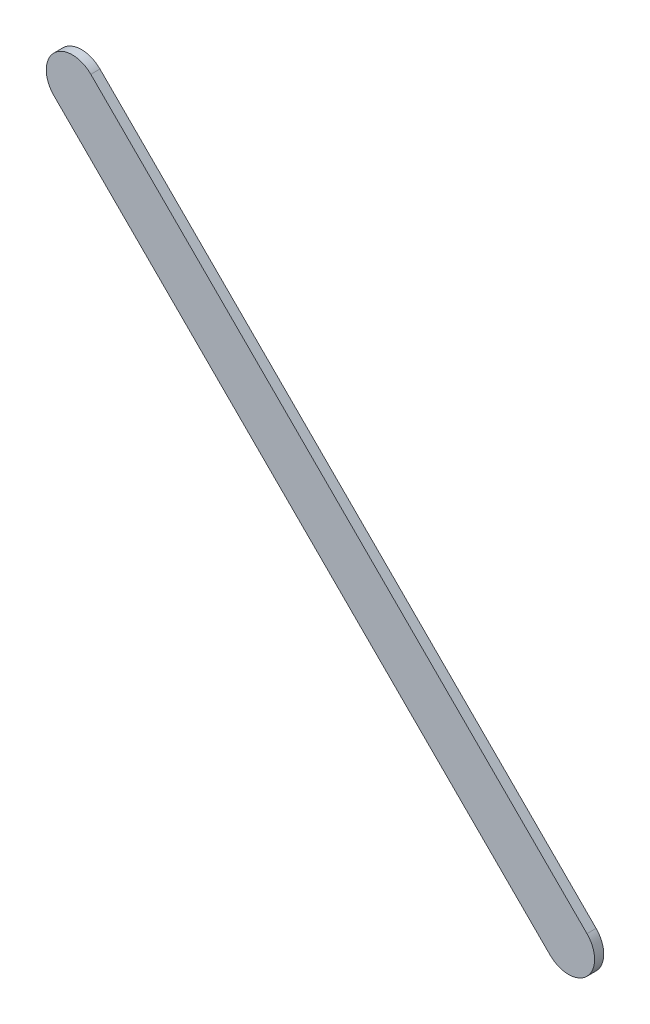
ISO-10303-21;
HEADER;
FILE_DESCRIPTION(('STEP AP214'),'2;1');
FILE_NAME('part.step','',(''),(''),'','','');
FILE_SCHEMA(('AUTOMOTIVE_DESIGN { 1 0 10303 214 1 1 1 1 }'));
ENDSEC;
DATA;
#1=APPLICATION_CONTEXT('core data for automotive mechanical design processes');
#2=APPLICATION_PROTOCOL_DEFINITION('international standard','automotive_design',2000,#1);
#3=PRODUCT_CONTEXT('',#1,'mechanical');
#4=PRODUCT('Part','Part','',(#3));
#5=PRODUCT_RELATED_PRODUCT_CATEGORY('part','',(#4));
#6=PRODUCT_DEFINITION_FORMATION('','',#4);
#7=PRODUCT_DEFINITION_CONTEXT('part definition',#1,'design');
#8=PRODUCT_DEFINITION('design','',#6,#7);
#9=PRODUCT_DEFINITION_SHAPE('','',#8);
#10=(LENGTH_UNIT() NAMED_UNIT(*) SI_UNIT(.MILLI.,.METRE.));
#11=(NAMED_UNIT(*) PLANE_ANGLE_UNIT() SI_UNIT($,.RADIAN.));
#12=(NAMED_UNIT(*) SI_UNIT($,.STERADIAN.) SOLID_ANGLE_UNIT());
#13=UNCERTAINTY_MEASURE_WITH_UNIT(LENGTH_MEASURE(1.E-05),#10,'distance_accuracy_value','');
#14=(GEOMETRIC_REPRESENTATION_CONTEXT(3) GLOBAL_UNCERTAINTY_ASSIGNED_CONTEXT((#13)) GLOBAL_UNIT_ASSIGNED_CONTEXT((#10,
#11,#12)) REPRESENTATION_CONTEXT('',''));
#15=CARTESIAN_POINT('',(0.,0.,0.));
#16=DIRECTION('',(0.,0.,1.));
#17=DIRECTION('',(1.,0.,0.));
#18=AXIS2_PLACEMENT_3D('',#15,#16,#17);
#19=CARTESIAN_POINT('',(85.391789,-130.37071,1.635));
#20=DIRECTION('',(0.,0.,1.));
#21=DIRECTION('',(1.,0.,0.));
#22=AXIS2_PLACEMENT_3D('',#19,#20,#21);
#23=PLANE('',#22);
#24=DIRECTION('',(0.707106781186548,-0.707106781186548,0.));
#25=VECTOR('',#24,1.);
#26=CARTESIAN_POINT('',(85.391789,-130.37071,1.635));
#27=LINE('',#26,#25);
#28=CARTESIAN_POINT('',(85.391789,-130.37071,1.635));
#29=VERTEX_POINT('',#28);
#30=CARTESIAN_POINT('',(87.291789,-132.27071,1.635));
#31=VERTEX_POINT('',#30);
#32=EDGE_CURVE('E70',#29,#31,#27,.T.);
#33=ORIENTED_EDGE('',*,*,#32,.T.);
#34=CARTESIAN_POINT('',(87.3624995,-132.1999995,1.635));
#35=DIRECTION('',(0.,0.,1.));
#36=DIRECTION('',(-0.707106781186048,-0.707106781187047,0.));
#37=AXIS2_PLACEMENT_3D('',#34,#35,#36);
#38=CIRCLE('',#37,0.09999974810219);
#39=CARTESIAN_POINT('',(87.43321,-132.129289,1.635));
#40=VERTEX_POINT('',#39);
#41=EDGE_CURVE('E107',#31,#40,#38,.T.);
#42=ORIENTED_EDGE('',*,*,#41,.T.);
#43=DIRECTION('',(-0.707106781186548,0.707106781186548,0.));
#44=VECTOR('',#43,1.);
#45=CARTESIAN_POINT('',(87.43321,-132.129289,1.635));
#46=LINE('',#45,#44);
#47=CARTESIAN_POINT('',(85.53321,-130.229289,1.635));
#48=VERTEX_POINT('',#47);
#49=EDGE_CURVE('E72',#40,#48,#46,.T.);
#50=ORIENTED_EDGE('',*,*,#49,.T.);
#51=CARTESIAN_POINT('',(85.4624995,-130.2999995,1.635));
#52=DIRECTION('',(0.,0.,1.));
#53=DIRECTION('',(0.707106781186048,0.707106781187047,0.));
#54=AXIS2_PLACEMENT_3D('',#51,#52,#53);
#55=CIRCLE('',#54,0.09999974810219);
#56=EDGE_CURVE('E11',#48,#29,#55,.T.);
#57=ORIENTED_EDGE('',*,*,#56,.T.);
#58=EDGE_LOOP('',(#33,#42,#50,#57));
#59=FACE_BOUND('',#58,.T.);
#60=ADVANCED_FACE('F17',(#59),#23,.T.);
#61=CARTESIAN_POINT('',(85.391789,-130.37071,1.6));
#62=DIRECTION('',(0.,0.,1.));
#63=DIRECTION('',(1.,0.,0.));
#64=AXIS2_PLACEMENT_3D('',#61,#62,#63);
#65=PLANE('',#64);
#66=CARTESIAN_POINT('',(85.4624995,-130.2999995,1.6));
#67=DIRECTION('',(0.,0.,1.));
#68=DIRECTION('',(0.707106781186048,0.707106781187047,0.));
#69=AXIS2_PLACEMENT_3D('',#66,#67,#68);
#70=CIRCLE('',#69,0.09999974810219);
#71=CARTESIAN_POINT('',(85.53321,-130.229289,1.6));
#72=VERTEX_POINT('',#71);
#73=CARTESIAN_POINT('',(85.391789,-130.37071,1.6));
#74=VERTEX_POINT('',#73);
#75=EDGE_CURVE('E25',#72,#74,#70,.T.);
#76=ORIENTED_EDGE('',*,*,#75,.F.);
#77=DIRECTION('',(-0.707106781186548,0.707106781186548,0.));
#78=VECTOR('',#77,1.);
#79=CARTESIAN_POINT('',(87.43321,-132.129289,1.6));
#80=LINE('',#79,#78);
#81=CARTESIAN_POINT('',(87.43321,-132.129289,1.6));
#82=VERTEX_POINT('',#81);
#83=EDGE_CURVE('E95',#82,#72,#80,.T.);
#84=ORIENTED_EDGE('',*,*,#83,.F.);
#85=CARTESIAN_POINT('',(87.3624995,-132.1999995,1.6));
#86=DIRECTION('',(0.,0.,1.));
#87=DIRECTION('',(-0.707106781186048,-0.707106781187047,0.));
#88=AXIS2_PLACEMENT_3D('',#85,#86,#87);
#89=CIRCLE('',#88,0.09999974810219);
#90=CARTESIAN_POINT('',(87.291789,-132.27071,1.6));
#91=VERTEX_POINT('',#90);
#92=EDGE_CURVE('E80',#91,#82,#89,.T.);
#93=ORIENTED_EDGE('',*,*,#92,.F.);
#94=DIRECTION('',(0.707106781186548,-0.707106781186548,0.));
#95=VECTOR('',#94,1.);
#96=CARTESIAN_POINT('',(85.391789,-130.37071,1.6));
#97=LINE('',#96,#95);
#98=EDGE_CURVE('E91',#74,#91,#97,.T.);
#99=ORIENTED_EDGE('',*,*,#98,.F.);
#100=EDGE_LOOP('',(#76,#84,#93,#99));
#101=FACE_BOUND('',#100,.T.);
#102=ADVANCED_FACE('F118',(#101),#65,.F.);
#103=CARTESIAN_POINT('',(85.4624995,-130.2999995,1.6));
#104=DIRECTION('',(0.,0.,-1.));
#105=DIRECTION('',(0.707106781186048,0.707106781187048,0.));
#106=AXIS2_PLACEMENT_3D('',#103,#104,#105);
#107=CYLINDRICAL_SURFACE('',#106,0.09999974810219);
#108=ORIENTED_EDGE('',*,*,#75,.T.);
#109=DIRECTION('',(0.,0.,1.));
#110=VECTOR('',#109,1.);
#111=CARTESIAN_POINT('',(85.391789,-130.37071,1.6));
#112=LINE('',#111,#110);
#113=EDGE_CURVE('E75',#74,#29,#112,.T.);
#114=ORIENTED_EDGE('',*,*,#113,.T.);
#115=ORIENTED_EDGE('',*,*,#56,.F.);
#116=DIRECTION('',(0.,0.,1.));
#117=VECTOR('',#116,1.);
#118=CARTESIAN_POINT('',(85.53321,-130.229289,1.6));
#119=LINE('',#118,#117);
#120=EDGE_CURVE('E97',#72,#48,#119,.T.);
#121=ORIENTED_EDGE('',*,*,#120,.F.);
#122=EDGE_LOOP('',(#108,#114,#115,#121));
#123=FACE_BOUND('',#122,.T.);
#124=ADVANCED_FACE('F76',(#123),#107,.T.);
#125=CARTESIAN_POINT('',(87.43321,-132.129289,1.6));
#126=DIRECTION('',(-0.707106781186548,-0.707106781186548,0.));
#127=DIRECTION('',(-0.707106781186548,0.707106781186548,0.));
#128=AXIS2_PLACEMENT_3D('',#125,#126,#127);
#129=PLANE('',#128);
#130=ORIENTED_EDGE('',*,*,#83,.T.);
#131=ORIENTED_EDGE('',*,*,#120,.T.);
#132=ORIENTED_EDGE('',*,*,#49,.F.);
#133=DIRECTION('',(0.,0.,1.));
#134=VECTOR('',#133,1.);
#135=CARTESIAN_POINT('',(87.43321,-132.129289,1.6));
#136=LINE('',#135,#134);
#137=EDGE_CURVE('E102',#82,#40,#136,.T.);
#138=ORIENTED_EDGE('',*,*,#137,.F.);
#139=EDGE_LOOP('',(#130,#131,#132,#138));
#140=FACE_BOUND('',#139,.T.);
#141=ADVANCED_FACE('F117',(#140),#129,.F.);
#142=CARTESIAN_POINT('',(87.3624995,-132.1999995,1.6));
#143=DIRECTION('',(0.,0.,-1.));
#144=DIRECTION('',(-0.707106781186048,-0.707106781187048,0.));
#145=AXIS2_PLACEMENT_3D('',#142,#143,#144);
#146=CYLINDRICAL_SURFACE('',#145,0.09999974810219);
#147=ORIENTED_EDGE('',*,*,#92,.T.);
#148=ORIENTED_EDGE('',*,*,#137,.T.);
#149=ORIENTED_EDGE('',*,*,#41,.F.);
#150=DIRECTION('',(0.,0.,1.));
#151=VECTOR('',#150,1.);
#152=CARTESIAN_POINT('',(87.291789,-132.27071,1.6));
#153=LINE('',#152,#151);
#154=EDGE_CURVE('E84',#91,#31,#153,.T.);
#155=ORIENTED_EDGE('',*,*,#154,.F.);
#156=EDGE_LOOP('',(#147,#148,#149,#155));
#157=FACE_BOUND('',#156,.T.);
#158=ADVANCED_FACE('F120',(#157),#146,.T.);
#159=CARTESIAN_POINT('',(85.391789,-130.37071,1.6));
#160=DIRECTION('',(0.707106781186548,0.707106781186548,0.));
#161=DIRECTION('',(0.,0.,-1.));
#162=AXIS2_PLACEMENT_3D('',#159,#160,#161);
#163=PLANE('',#162);
#164=ORIENTED_EDGE('',*,*,#98,.T.);
#165=ORIENTED_EDGE('',*,*,#154,.T.);
#166=ORIENTED_EDGE('',*,*,#32,.F.);
#167=ORIENTED_EDGE('',*,*,#113,.F.);
#168=EDGE_LOOP('',(#164,#165,#166,#167));
#169=FACE_BOUND('',#168,.T.);
#170=ADVANCED_FACE('F82',(#169),#163,.F.);
#171=CLOSED_SHELL('',(#60,#102,#124,#141,#158,#170));
#172=MANIFOLD_SOLID_BREP('B1',#171);
#173=ADVANCED_BREP_SHAPE_REPRESENTATION('',(#18,#172),#14);
#174=SHAPE_DEFINITION_REPRESENTATION(#9,#173);
ENDSEC;
END-ISO-10303-21;
